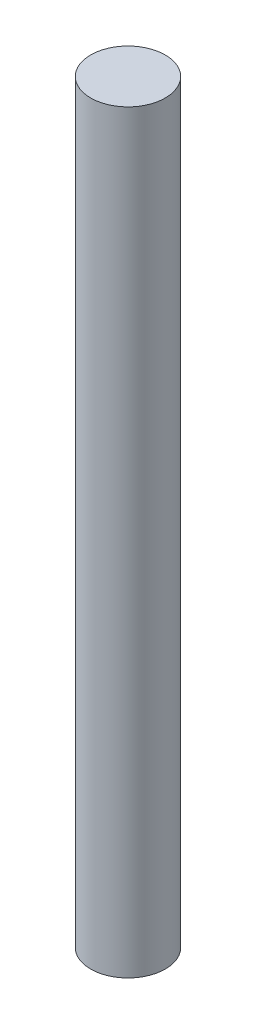
ISO-10303-21;
HEADER;
FILE_DESCRIPTION(('STEP AP214'),'2;1');
FILE_NAME('part.step','',(''),(''),'','','');
FILE_SCHEMA(('AUTOMOTIVE_DESIGN { 1 0 10303 214 1 1 1 1 }'));
ENDSEC;
DATA;
#1=APPLICATION_CONTEXT('core data for automotive mechanical design processes');
#2=APPLICATION_PROTOCOL_DEFINITION('international standard','automotive_design',2000,#1);
#3=PRODUCT_CONTEXT('',#1,'mechanical');
#4=PRODUCT('Part','Part','',(#3));
#5=PRODUCT_RELATED_PRODUCT_CATEGORY('part','',(#4));
#6=PRODUCT_DEFINITION_FORMATION('','',#4);
#7=PRODUCT_DEFINITION_CONTEXT('part definition',#1,'design');
#8=PRODUCT_DEFINITION('design','',#6,#7);
#9=PRODUCT_DEFINITION_SHAPE('','',#8);
#10=(LENGTH_UNIT() NAMED_UNIT(*) SI_UNIT(.MILLI.,.METRE.));
#11=(NAMED_UNIT(*) PLANE_ANGLE_UNIT() SI_UNIT($,.RADIAN.));
#12=(NAMED_UNIT(*) SI_UNIT($,.STERADIAN.) SOLID_ANGLE_UNIT());
#13=UNCERTAINTY_MEASURE_WITH_UNIT(LENGTH_MEASURE(1.E-05),#10,'distance_accuracy_value','');
#14=(GEOMETRIC_REPRESENTATION_CONTEXT(3) GLOBAL_UNCERTAINTY_ASSIGNED_CONTEXT((#13)) GLOBAL_UNIT_ASSIGNED_CONTEXT((#10,
#11,#12)) REPRESENTATION_CONTEXT('',''));
#15=CARTESIAN_POINT('',(0.,0.,0.));
#16=DIRECTION('',(0.,0.,1.));
#17=DIRECTION('',(1.,0.,0.));
#18=AXIS2_PLACEMENT_3D('',#15,#16,#17);
#19=CARTESIAN_POINT('',(0.,80.9,0.));
#20=DIRECTION('',(0.,-1.,0.));
#21=DIRECTION('',(0.,0.,-1.));
#22=AXIS2_PLACEMENT_3D('',#19,#20,#21);
#23=CYLINDRICAL_SURFACE('',#22,4.);
#24=CARTESIAN_POINT('',(0.,80.9,0.));
#25=DIRECTION('',(0.,1.,0.));
#26=DIRECTION('',(0.,0.,1.));
#27=AXIS2_PLACEMENT_3D('',#24,#25,#26);
#28=CIRCLE('',#27,4.);
#29=CARTESIAN_POINT('',(0.,80.9,4.));
#30=VERTEX_POINT('',#29);
#31=EDGE_CURVE('E10',#30,#30,#28,.T.);
#32=ORIENTED_EDGE('',*,*,#31,.F.);
#33=EDGE_LOOP('',(#32));
#34=FACE_BOUND('',#33,.T.);
#35=CARTESIAN_POINT('',(0.,0.,0.));
#36=DIRECTION('',(0.,1.,0.));
#37=DIRECTION('',(0.,0.,1.));
#38=AXIS2_PLACEMENT_3D('',#35,#36,#37);
#39=CIRCLE('',#38,4.);
#40=CARTESIAN_POINT('',(0.,0.,4.));
#41=VERTEX_POINT('',#40);
#42=EDGE_CURVE('E42',#41,#41,#39,.T.);
#43=ORIENTED_EDGE('',*,*,#42,.T.);
#44=EDGE_LOOP('',(#43));
#45=FACE_BOUND('',#44,.T.);
#46=ADVANCED_FACE('F39',(#34,#45),#23,.T.);
#47=CARTESIAN_POINT('',(0.,80.9,0.));
#48=DIRECTION('',(0.,1.,0.));
#49=DIRECTION('',(0.,0.,1.));
#50=AXIS2_PLACEMENT_3D('',#47,#48,#49);
#51=PLANE('',#50);
#52=ORIENTED_EDGE('',*,*,#31,.T.);
#53=EDGE_LOOP('',(#52));
#54=FACE_BOUND('',#53,.T.);
#55=ADVANCED_FACE('F54',(#54),#51,.T.);
#56=CARTESIAN_POINT('',(0.,0.,0.));
#57=DIRECTION('',(0.,1.,0.));
#58=DIRECTION('',(0.,0.,1.));
#59=AXIS2_PLACEMENT_3D('',#56,#57,#58);
#60=PLANE('',#59);
#61=ORIENTED_EDGE('',*,*,#42,.F.);
#62=EDGE_LOOP('',(#61));
#63=FACE_BOUND('',#62,.T.);
#64=ADVANCED_FACE('F52',(#63),#60,.F.);
#65=CLOSED_SHELL('',(#46,#55,#64));
#66=MANIFOLD_SOLID_BREP('B2',#65);
#67=ADVANCED_BREP_SHAPE_REPRESENTATION('',(#18,#66),#14);
#68=SHAPE_DEFINITION_REPRESENTATION(#9,#67);
ENDSEC;
END-ISO-10303-21;
